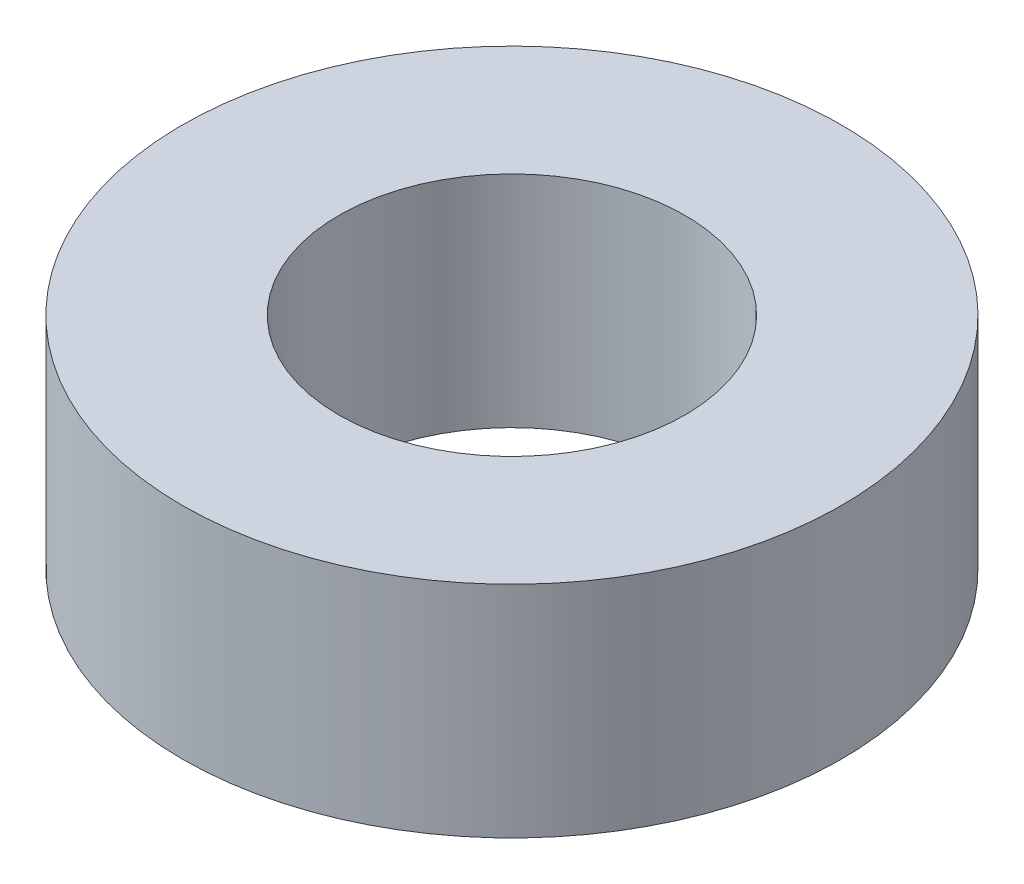
ISO-10303-21;
HEADER;
FILE_DESCRIPTION(('STEP AP214'),'2;1');
FILE_NAME('part.step','',(''),(''),'','','');
FILE_SCHEMA(('AUTOMOTIVE_DESIGN { 1 0 10303 214 1 1 1 1 }'));
ENDSEC;
DATA;
#1=APPLICATION_CONTEXT('core data for automotive mechanical design processes');
#2=APPLICATION_PROTOCOL_DEFINITION('international standard','automotive_design',2000,#1);
#3=PRODUCT_CONTEXT('',#1,'mechanical');
#4=PRODUCT('Part','Part','',(#3));
#5=PRODUCT_RELATED_PRODUCT_CATEGORY('part','',(#4));
#6=PRODUCT_DEFINITION_FORMATION('','',#4);
#7=PRODUCT_DEFINITION_CONTEXT('part definition',#1,'design');
#8=PRODUCT_DEFINITION('design','',#6,#7);
#9=PRODUCT_DEFINITION_SHAPE('','',#8);
#10=(LENGTH_UNIT() NAMED_UNIT(*) SI_UNIT(.MILLI.,.METRE.));
#11=(NAMED_UNIT(*) PLANE_ANGLE_UNIT() SI_UNIT($,.RADIAN.));
#12=(NAMED_UNIT(*) SI_UNIT($,.STERADIAN.) SOLID_ANGLE_UNIT());
#13=UNCERTAINTY_MEASURE_WITH_UNIT(LENGTH_MEASURE(1.E-05),#10,'distance_accuracy_value','');
#14=(GEOMETRIC_REPRESENTATION_CONTEXT(3) GLOBAL_UNCERTAINTY_ASSIGNED_CONTEXT((#13)) GLOBAL_UNIT_ASSIGNED_CONTEXT((#10,
#11,#12)) REPRESENTATION_CONTEXT('',''));
#15=CARTESIAN_POINT('',(0.,0.,0.));
#16=DIRECTION('',(0.,0.,1.));
#17=DIRECTION('',(1.,0.,0.));
#18=AXIS2_PLACEMENT_3D('',#15,#16,#17);
#19=CARTESIAN_POINT('',(0.,4.,0.));
#20=DIRECTION('',(0.,1.,0.));
#21=DIRECTION('',(0.,0.,1.));
#22=AXIS2_PLACEMENT_3D('',#19,#20,#21);
#23=PLANE('',#22);
#24=CARTESIAN_POINT('',(0.,4.,0.));
#25=DIRECTION('',(0.,1.,0.));
#26=DIRECTION('',(0.,0.,1.));
#27=AXIS2_PLACEMENT_3D('',#24,#25,#26);
#28=CIRCLE('',#27,6.);
#29=CARTESIAN_POINT('',(0.,4.,6.));
#30=VERTEX_POINT('',#29);
#31=EDGE_CURVE('E10',#30,#30,#28,.T.);
#32=ORIENTED_EDGE('',*,*,#31,.T.);
#33=EDGE_LOOP('',(#32));
#34=FACE_BOUND('',#33,.T.);
#35=CARTESIAN_POINT('',(0.,4.,0.));
#36=DIRECTION('',(0.,1.,0.));
#37=DIRECTION('',(0.,0.,1.));
#38=AXIS2_PLACEMENT_3D('',#35,#36,#37);
#39=CIRCLE('',#38,3.15);
#40=CARTESIAN_POINT('',(0.,4.,3.15));
#41=VERTEX_POINT('',#40);
#42=EDGE_CURVE('E48',#41,#41,#39,.T.);
#43=ORIENTED_EDGE('',*,*,#42,.F.);
#44=EDGE_LOOP('',(#43));
#45=FACE_BOUND('',#44,.T.);
#46=ADVANCED_FACE('F37',(#34,#45),#23,.T.);
#47=CARTESIAN_POINT('',(0.,0.,0.));
#48=DIRECTION('',(0.,1.,0.));
#49=DIRECTION('',(0.,0.,1.));
#50=AXIS2_PLACEMENT_3D('',#47,#48,#49);
#51=PLANE('',#50);
#52=CARTESIAN_POINT('',(0.,0.,0.));
#53=DIRECTION('',(0.,1.,0.));
#54=DIRECTION('',(0.,0.,1.));
#55=AXIS2_PLACEMENT_3D('',#52,#53,#54);
#56=CIRCLE('',#55,6.);
#57=CARTESIAN_POINT('',(0.,0.,6.));
#58=VERTEX_POINT('',#57);
#59=EDGE_CURVE('E41',#58,#58,#56,.T.);
#60=ORIENTED_EDGE('',*,*,#59,.F.);
#61=EDGE_LOOP('',(#60));
#62=FACE_BOUND('',#61,.T.);
#63=CARTESIAN_POINT('',(0.,0.,0.));
#64=DIRECTION('',(0.,1.,0.));
#65=DIRECTION('',(0.,0.,1.));
#66=AXIS2_PLACEMENT_3D('',#63,#64,#65);
#67=CIRCLE('',#66,3.15);
#68=CARTESIAN_POINT('',(0.,0.,3.15));
#69=VERTEX_POINT('',#68);
#70=EDGE_CURVE('E50',#69,#69,#67,.T.);
#71=ORIENTED_EDGE('',*,*,#70,.T.);
#72=EDGE_LOOP('',(#71));
#73=FACE_BOUND('',#72,.T.);
#74=ADVANCED_FACE('F60',(#62,#73),#51,.F.);
#75=CARTESIAN_POINT('',(0.,4.,0.));
#76=DIRECTION('',(0.,-1.,0.));
#77=DIRECTION('',(0.,0.,-1.));
#78=AXIS2_PLACEMENT_3D('',#75,#76,#77);
#79=CYLINDRICAL_SURFACE('',#78,6.);
#80=ORIENTED_EDGE('',*,*,#31,.F.);
#81=EDGE_LOOP('',(#80));
#82=FACE_BOUND('',#81,.T.);
#83=ORIENTED_EDGE('',*,*,#59,.T.);
#84=EDGE_LOOP('',(#83));
#85=FACE_BOUND('',#84,.T.);
#86=ADVANCED_FACE('F39',(#82,#85),#79,.T.);
#87=CARTESIAN_POINT('',(0.,4.,0.));
#88=DIRECTION('',(0.,-1.,0.));
#89=DIRECTION('',(0.,0.,-1.));
#90=AXIS2_PLACEMENT_3D('',#87,#88,#89);
#91=CYLINDRICAL_SURFACE('',#90,3.15);
#92=ORIENTED_EDGE('',*,*,#42,.T.);
#93=EDGE_LOOP('',(#92));
#94=FACE_BOUND('',#93,.T.);
#95=ORIENTED_EDGE('',*,*,#70,.F.);
#96=EDGE_LOOP('',(#95));
#97=FACE_BOUND('',#96,.T.);
#98=ADVANCED_FACE('F56',(#94,#97),#91,.F.);
#99=CLOSED_SHELL('',(#46,#74,#86,#98));
#100=MANIFOLD_SOLID_BREP('B2',#99);
#101=ADVANCED_BREP_SHAPE_REPRESENTATION('',(#18,#100),#14);
#102=SHAPE_DEFINITION_REPRESENTATION(#9,#101);
ENDSEC;
END-ISO-10303-21;
